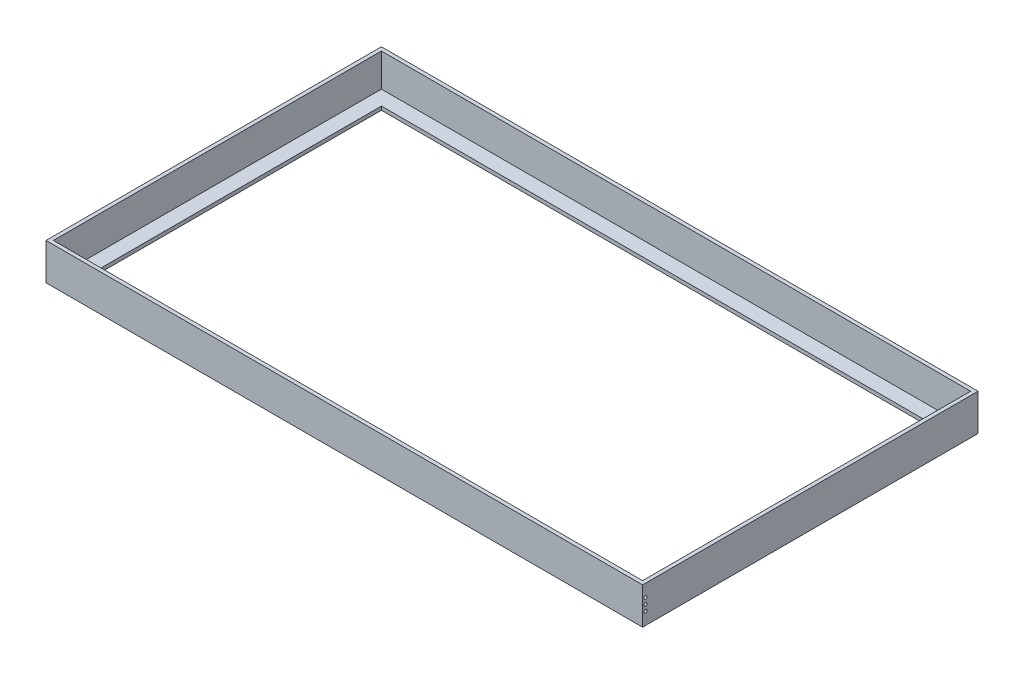
ISO-10303-21;
HEADER;
FILE_DESCRIPTION(('STEP AP214'),'2;1');
FILE_NAME('part.step','',(''),(''),'','','');
FILE_SCHEMA(('AUTOMOTIVE_DESIGN { 1 0 10303 214 1 1 1 1 }'));
ENDSEC;
DATA;
#1=APPLICATION_CONTEXT('core data for automotive mechanical design processes');
#2=APPLICATION_PROTOCOL_DEFINITION('international standard','automotive_design',2000,#1);
#3=PRODUCT_CONTEXT('',#1,'mechanical');
#4=PRODUCT('Part','Part','',(#3));
#5=PRODUCT_RELATED_PRODUCT_CATEGORY('part','',(#4));
#6=PRODUCT_DEFINITION_FORMATION('','',#4);
#7=PRODUCT_DEFINITION_CONTEXT('part definition',#1,'design');
#8=PRODUCT_DEFINITION('design','',#6,#7);
#9=PRODUCT_DEFINITION_SHAPE('','',#8);
#10=(LENGTH_UNIT() NAMED_UNIT(*) SI_UNIT(.MILLI.,.METRE.));
#11=(NAMED_UNIT(*) PLANE_ANGLE_UNIT() SI_UNIT($,.RADIAN.));
#12=(NAMED_UNIT(*) SI_UNIT($,.STERADIAN.) SOLID_ANGLE_UNIT());
#13=UNCERTAINTY_MEASURE_WITH_UNIT(LENGTH_MEASURE(1.E-05),#10,'distance_accuracy_value','');
#14=(GEOMETRIC_REPRESENTATION_CONTEXT(3) GLOBAL_UNCERTAINTY_ASSIGNED_CONTEXT((#13)) GLOBAL_UNIT_ASSIGNED_CONTEXT((#10,
#11,#12)) REPRESENTATION_CONTEXT('',''));
#15=CARTESIAN_POINT('',(0.,0.,0.));
#16=DIRECTION('',(0.,0.,1.));
#17=DIRECTION('',(1.,0.,0.));
#18=AXIS2_PLACEMENT_3D('',#15,#16,#17);
#19=CARTESIAN_POINT('',(0.,100.,-10.));
#20=DIRECTION('',(0.,0.,-1.));
#21=DIRECTION('',(-1.,0.,0.));
#22=AXIS2_PLACEMENT_3D('',#19,#20,#21);
#23=PLANE('',#22);
#24=DIRECTION('',(1.,0.,0.));
#25=VECTOR('',#24,1.);
#26=CARTESIAN_POINT('',(0.,37.0930549951046,-10.));
#27=LINE('',#26,#25);
#28=CARTESIAN_POINT('',(10.,37.0930549951046,-10.));
#29=VERTEX_POINT('',#28);
#30=CARTESIAN_POINT('',(1616.4,37.0930549951046,-10.));
#31=VERTEX_POINT('',#30);
#32=EDGE_CURVE('E66',#29,#31,#27,.T.);
#33=ORIENTED_EDGE('',*,*,#32,.F.);
#34=DIRECTION('',(0.,-1.,0.));
#35=VECTOR('',#34,1.);
#36=CARTESIAN_POINT('',(10.,100.,-10.));
#37=LINE('',#36,#35);
#38=CARTESIAN_POINT('',(10.,46.6269450048954,-10.));
#39=VERTEX_POINT('',#38);
#40=EDGE_CURVE('E214',#39,#29,#37,.T.);
#41=ORIENTED_EDGE('',*,*,#40,.F.);
#42=DIRECTION('',(1.,0.,0.));
#43=VECTOR('',#42,1.);
#44=CARTESIAN_POINT('',(0.,46.6269450048954,-10.));
#45=LINE('',#44,#43);
#46=CARTESIAN_POINT('',(1616.4,46.6269450048954,-10.));
#47=VERTEX_POINT('',#46);
#48=EDGE_CURVE('E288',#47,#39,#45,.F.);
#49=ORIENTED_EDGE('',*,*,#48,.F.);
#50=DIRECTION('',(0.,-1.,0.));
#51=VECTOR('',#50,1.);
#52=CARTESIAN_POINT('',(1616.4,100.,-10.));
#53=LINE('',#52,#51);
#54=EDGE_CURVE('E197',#47,#31,#53,.T.);
#55=ORIENTED_EDGE('',*,*,#54,.T.);
#56=EDGE_LOOP('',(#33,#41,#49,#55));
#57=FACE_BOUND('',#56,.T.);
#58=ADVANCED_FACE('F51',(#57),#23,.T.);
#59=DIRECTION('',(1.,0.,0.));
#60=VECTOR('',#59,1.);
#61=CARTESIAN_POINT('',(0.,69.6530549951046,-10.));
#62=LINE('',#61,#60);
#63=CARTESIAN_POINT('',(10.,69.6530549951046,-10.));
#64=VERTEX_POINT('',#63);
#65=CARTESIAN_POINT('',(1616.4,69.6530549951046,-10.));
#66=VERTEX_POINT('',#65);
#67=EDGE_CURVE('E74',#64,#66,#62,.T.);
#68=ORIENTED_EDGE('',*,*,#67,.F.);
#69=CARTESIAN_POINT('',(10.,100.,-10.));
#70=VERTEX_POINT('',#69);
#71=EDGE_CURVE('E217',#70,#64,#37,.T.);
#72=ORIENTED_EDGE('',*,*,#71,.F.);
#73=DIRECTION('',(1.,0.,0.));
#74=VECTOR('',#73,1.);
#75=CARTESIAN_POINT('',(0.,100.,-10.));
#76=LINE('',#75,#74);
#77=CARTESIAN_POINT('',(1616.4,100.,-10.));
#78=VERTEX_POINT('',#77);
#79=EDGE_CURVE('E370',#70,#78,#76,.T.);
#80=ORIENTED_EDGE('',*,*,#79,.T.);
#81=EDGE_CURVE('E201',#78,#66,#53,.T.);
#82=ORIENTED_EDGE('',*,*,#81,.T.);
#83=EDGE_LOOP('',(#68,#72,#80,#82));
#84=FACE_BOUND('',#83,.T.);
#85=ADVANCED_FACE('F413',(#84),#23,.T.);
#86=DIRECTION('',(1.,0.,0.));
#87=VECTOR('',#86,1.);
#88=CARTESIAN_POINT('',(0.,62.9069450048954,-10.));
#89=LINE('',#88,#87);
#90=CARTESIAN_POINT('',(1616.4,62.9069450048954,-10.));
#91=VERTEX_POINT('',#90);
#92=CARTESIAN_POINT('',(10.,62.9069450048954,-10.));
#93=VERTEX_POINT('',#92);
#94=EDGE_CURVE('E272',#91,#93,#89,.F.);
#95=ORIENTED_EDGE('',*,*,#94,.F.);
#96=CARTESIAN_POINT('',(1616.4,53.3730549951046,-10.));
#97=VERTEX_POINT('',#96);
#98=EDGE_CURVE('E200',#91,#97,#53,.T.);
#99=ORIENTED_EDGE('',*,*,#98,.T.);
#100=DIRECTION('',(1.,0.,0.));
#101=VECTOR('',#100,1.);
#102=CARTESIAN_POINT('',(0.,53.3730549951046,-10.));
#103=LINE('',#102,#101);
#104=CARTESIAN_POINT('',(10.,53.3730549951046,-10.));
#105=VERTEX_POINT('',#104);
#106=EDGE_CURVE('E290',#105,#97,#103,.T.);
#107=ORIENTED_EDGE('',*,*,#106,.F.);
#108=EDGE_CURVE('E216',#93,#105,#37,.T.);
#109=ORIENTED_EDGE('',*,*,#108,.F.);
#110=EDGE_LOOP('',(#95,#99,#107,#109));
#111=FACE_BOUND('',#110,.T.);
#112=ADVANCED_FACE('F276',(#111),#23,.T.);
#113=CARTESIAN_POINT('',(0.,10.,0.));
#114=DIRECTION('',(0.,-1.,0.));
#115=DIRECTION('',(0.,0.,-1.));
#116=AXIS2_PLACEMENT_3D('',#113,#114,#115);
#117=PLANE('',#116);
#118=DIRECTION('',(0.,0.,1.));
#119=VECTOR('',#118,1.);
#120=CARTESIAN_POINT('',(10.,10.,0.));
#121=LINE('',#120,#119);
#122=CARTESIAN_POINT('',(10.,10.,-904.4));
#123=VERTEX_POINT('',#122);
#124=CARTESIAN_POINT('',(10.,10.,-10.));
#125=VERTEX_POINT('',#124);
#126=EDGE_CURVE('E342',#123,#125,#121,.T.);
#127=ORIENTED_EDGE('',*,*,#126,.T.);
#128=DIRECTION('',(1.,0.,0.));
#129=VECTOR('',#128,1.);
#130=CARTESIAN_POINT('',(0.,10.,-10.));
#131=LINE('',#130,#129);
#132=CARTESIAN_POINT('',(1616.4,10.,-10.));
#133=VERTEX_POINT('',#132);
#134=EDGE_CURVE('E353',#125,#133,#131,.T.);
#135=ORIENTED_EDGE('',*,*,#134,.T.);
#136=DIRECTION('',(0.,0.,-1.));
#137=VECTOR('',#136,1.);
#138=CARTESIAN_POINT('',(1616.4,10.,0.));
#139=LINE('',#138,#137);
#140=CARTESIAN_POINT('',(1616.4,10.,-904.4));
#141=VERTEX_POINT('',#140);
#142=EDGE_CURVE('E195',#133,#141,#139,.T.);
#143=ORIENTED_EDGE('',*,*,#142,.T.);
#144=DIRECTION('',(-1.,0.,0.));
#145=VECTOR('',#144,1.);
#146=CARTESIAN_POINT('',(0.,10.,-904.4));
#147=LINE('',#146,#145);
#148=EDGE_CURVE('E357',#141,#123,#147,.T.);
#149=ORIENTED_EDGE('',*,*,#148,.T.);
#150=EDGE_LOOP('',(#127,#135,#143,#149));
#151=FACE_BOUND('',#150,.T.);
#152=DIRECTION('',(0.,0.,1.));
#153=VECTOR('',#152,1.);
#154=CARTESIAN_POINT('',(50.,10.,-864.4));
#155=LINE('',#154,#153);
#156=CARTESIAN_POINT('',(50.,10.,-864.4));
#157=VERTEX_POINT('',#156);
#158=CARTESIAN_POINT('',(50.0000000000001,10.,-50.));
#159=VERTEX_POINT('',#158);
#160=EDGE_CURVE('E307',#157,#159,#155,.T.);
#161=ORIENTED_EDGE('',*,*,#160,.F.);
#162=DIRECTION('',(-1.,0.,0.));
#163=VECTOR('',#162,1.);
#164=CARTESIAN_POINT('',(50.,10.,-864.4));
#165=LINE('',#164,#163);
#166=CARTESIAN_POINT('',(1576.4,10.,-864.4));
#167=VERTEX_POINT('',#166);
#168=EDGE_CURVE('E313',#167,#157,#165,.T.);
#169=ORIENTED_EDGE('',*,*,#168,.F.);
#170=DIRECTION('',(0.,0.,-1.));
#171=VECTOR('',#170,1.);
#172=CARTESIAN_POINT('',(1576.4,10.,-864.4));
#173=LINE('',#172,#171);
#174=CARTESIAN_POINT('',(1576.4,10.,-50.));
#175=VERTEX_POINT('',#174);
#176=EDGE_CURVE('E333',#175,#167,#173,.T.);
#177=ORIENTED_EDGE('',*,*,#176,.F.);
#178=DIRECTION('',(1.,0.,0.));
#179=VECTOR('',#178,1.);
#180=CARTESIAN_POINT('',(50.0000000000001,10.,-50.));
#181=LINE('',#180,#179);
#182=EDGE_CURVE('E329',#159,#175,#181,.T.);
#183=ORIENTED_EDGE('',*,*,#182,.F.);
#184=EDGE_LOOP('',(#161,#169,#177,#183));
#185=FACE_BOUND('',#184,.T.);
#186=ADVANCED_FACE('F425',(#151,#185),#117,.F.);
#187=CARTESIAN_POINT('',(0.,100.,0.));
#188=DIRECTION('',(0.,-1.,0.));
#189=DIRECTION('',(0.,0.,-1.));
#190=AXIS2_PLACEMENT_3D('',#187,#188,#189);
#191=PLANE('',#190);
#192=DIRECTION('',(0.,0.,1.));
#193=VECTOR('',#192,1.);
#194=CARTESIAN_POINT('',(0.,100.,0.));
#195=LINE('',#194,#193);
#196=CARTESIAN_POINT('',(0.,100.,-914.4));
#197=VERTEX_POINT('',#196);
#198=CARTESIAN_POINT('',(0.,100.,0.));
#199=VERTEX_POINT('',#198);
#200=EDGE_CURVE('E250',#197,#199,#195,.T.);
#201=ORIENTED_EDGE('',*,*,#200,.T.);
#202=DIRECTION('',(1.,0.,0.));
#203=VECTOR('',#202,1.);
#204=CARTESIAN_POINT('',(0.,100.,0.));
#205=LINE('',#204,#203);
#206=CARTESIAN_POINT('',(1626.4,100.,0.));
#207=VERTEX_POINT('',#206);
#208=EDGE_CURVE('E377',#199,#207,#205,.T.);
#209=ORIENTED_EDGE('',*,*,#208,.T.);
#210=DIRECTION('',(0.,0.,-1.));
#211=VECTOR('',#210,1.);
#212=CARTESIAN_POINT('',(1626.4,100.,0.));
#213=LINE('',#212,#211);
#214=CARTESIAN_POINT('',(1626.4,100.,-914.4));
#215=VERTEX_POINT('',#214);
#216=EDGE_CURVE('E379',#207,#215,#213,.T.);
#217=ORIENTED_EDGE('',*,*,#216,.T.);
#218=DIRECTION('',(-1.,0.,0.));
#219=VECTOR('',#218,1.);
#220=CARTESIAN_POINT('',(0.,100.,-914.4));
#221=LINE('',#220,#219);
#222=EDGE_CURVE('E242',#215,#197,#221,.T.);
#223=ORIENTED_EDGE('',*,*,#222,.T.);
#224=EDGE_LOOP('',(#201,#209,#217,#223));
#225=FACE_BOUND('',#224,.T.);
#226=DIRECTION('',(0.,0.,1.));
#227=VECTOR('',#226,1.);
#228=CARTESIAN_POINT('',(10.,100.,0.));
#229=LINE('',#228,#227);
#230=CARTESIAN_POINT('',(10.,100.,-904.4));
#231=VERTEX_POINT('',#230);
#232=EDGE_CURVE('E444',#231,#70,#229,.T.);
#233=ORIENTED_EDGE('',*,*,#232,.F.);
#234=DIRECTION('',(-1.,0.,0.));
#235=VECTOR('',#234,1.);
#236=CARTESIAN_POINT('',(0.,100.,-904.4));
#237=LINE('',#236,#235);
#238=CARTESIAN_POINT('',(1616.4,100.,-904.4));
#239=VERTEX_POINT('',#238);
#240=EDGE_CURVE('E360',#239,#231,#237,.T.);
#241=ORIENTED_EDGE('',*,*,#240,.F.);
#242=DIRECTION('',(0.,0.,-1.));
#243=VECTOR('',#242,1.);
#244=CARTESIAN_POINT('',(1616.4,100.,0.));
#245=LINE('',#244,#243);
#246=EDGE_CURVE('E365',#78,#239,#245,.T.);
#247=ORIENTED_EDGE('',*,*,#246,.F.);
#248=ORIENTED_EDGE('',*,*,#79,.F.);
#249=EDGE_LOOP('',(#233,#241,#247,#248));
#250=FACE_BOUND('',#249,.T.);
#251=ADVANCED_FACE('F387',(#225,#250),#191,.F.);
#252=CARTESIAN_POINT('',(0.,100.,0.));
#253=DIRECTION('',(1.,0.,0.));
#254=DIRECTION('',(0.,0.,-1.));
#255=AXIS2_PLACEMENT_3D('',#252,#253,#254);
#256=PLANE('',#255);
#257=CARTESIAN_POINT('',(0.,33.72,-7.85));
#258=DIRECTION('',(1.,0.,0.));
#259=DIRECTION('',(0.,0.,-1.));
#260=AXIS2_PLACEMENT_3D('',#257,#258,#259);
#261=CIRCLE('',#260,4.);
#262=CARTESIAN_POINT('',(0.,33.72,-11.85));
#263=VERTEX_POINT('',#262);
#264=EDGE_CURVE('E190',#263,#263,#261,.T.);
#265=ORIENTED_EDGE('',*,*,#264,.T.);
#266=EDGE_LOOP('',(#265));
#267=FACE_BOUND('',#266,.T.);
#268=CARTESIAN_POINT('',(0.,66.28,-7.85));
#269=DIRECTION('',(1.,0.,0.));
#270=DIRECTION('',(0.,0.,-1.));
#271=AXIS2_PLACEMENT_3D('',#268,#269,#270);
#272=CIRCLE('',#271,4.);
#273=CARTESIAN_POINT('',(0.,66.28,-11.85));
#274=VERTEX_POINT('',#273);
#275=EDGE_CURVE('E280',#274,#274,#272,.T.);
#276=ORIENTED_EDGE('',*,*,#275,.T.);
#277=EDGE_LOOP('',(#276));
#278=FACE_BOUND('',#277,.T.);
#279=CARTESIAN_POINT('',(0.,50.,-7.85));
#280=DIRECTION('',(1.,0.,0.));
#281=DIRECTION('',(0.,0.,-1.));
#282=AXIS2_PLACEMENT_3D('',#279,#280,#281);
#283=CIRCLE('',#282,4.00000000000001);
#284=CARTESIAN_POINT('',(0.,50.,-11.85));
#285=VERTEX_POINT('',#284);
#286=EDGE_CURVE('E294',#285,#285,#283,.T.);
#287=ORIENTED_EDGE('',*,*,#286,.T.);
#288=EDGE_LOOP('',(#287));
#289=FACE_BOUND('',#288,.T.);
#290=DIRECTION('',(0.,0.,1.));
#291=VECTOR('',#290,1.);
#292=CARTESIAN_POINT('',(0.,0.,0.));
#293=LINE('',#292,#291);
#294=CARTESIAN_POINT('',(0.,0.,-914.4));
#295=VERTEX_POINT('',#294);
#296=CARTESIAN_POINT('',(0.,0.,0.));
#297=VERTEX_POINT('',#296);
#298=EDGE_CURVE('E227',#295,#297,#293,.T.);
#299=ORIENTED_EDGE('',*,*,#298,.T.);
#300=DIRECTION('',(0.,-1.,0.));
#301=VECTOR('',#300,1.);
#302=CARTESIAN_POINT('',(0.,100.,0.));
#303=LINE('',#302,#301);
#304=EDGE_CURVE('E262',#199,#297,#303,.T.);
#305=ORIENTED_EDGE('',*,*,#304,.F.);
#306=ORIENTED_EDGE('',*,*,#200,.F.);
#307=DIRECTION('',(0.,-1.,0.));
#308=VECTOR('',#307,1.);
#309=CARTESIAN_POINT('',(0.,100.,-914.4));
#310=LINE('',#309,#308);
#311=EDGE_CURVE('E251',#197,#295,#310,.T.);
#312=ORIENTED_EDGE('',*,*,#311,.T.);
#313=EDGE_LOOP('',(#299,#305,#306,#312));
#314=FACE_BOUND('',#313,.T.);
#315=ADVANCED_FACE('F53',(#267,#278,#289,#314),#256,.F.);
#316=CARTESIAN_POINT('',(0.,100.,0.));
#317=DIRECTION('',(0.,0.,-1.));
#318=DIRECTION('',(-1.,0.,0.));
#319=AXIS2_PLACEMENT_3D('',#316,#317,#318);
#320=PLANE('',#319);
#321=DIRECTION('',(1.,0.,0.));
#322=VECTOR('',#321,1.);
#323=CARTESIAN_POINT('',(0.,0.,0.));
#324=LINE('',#323,#322);
#325=CARTESIAN_POINT('',(1626.4,0.,0.));
#326=VERTEX_POINT('',#325);
#327=EDGE_CURVE('E232',#297,#326,#324,.T.);
#328=ORIENTED_EDGE('',*,*,#327,.T.);
#329=DIRECTION('',(0.,-1.,0.));
#330=VECTOR('',#329,1.);
#331=CARTESIAN_POINT('',(1626.4,100.,0.));
#332=LINE('',#331,#330);
#333=EDGE_CURVE('E258',#207,#326,#332,.T.);
#334=ORIENTED_EDGE('',*,*,#333,.F.);
#335=ORIENTED_EDGE('',*,*,#208,.F.);
#336=ORIENTED_EDGE('',*,*,#304,.T.);
#337=EDGE_LOOP('',(#328,#334,#335,#336));
#338=FACE_BOUND('',#337,.T.);
#339=ADVANCED_FACE('F394',(#338),#320,.F.);
#340=CARTESIAN_POINT('',(1626.4,100.,0.));
#341=DIRECTION('',(-1.,0.,0.));
#342=DIRECTION('',(0.,0.,1.));
#343=AXIS2_PLACEMENT_3D('',#340,#341,#342);
#344=PLANE('',#343);
#345=CARTESIAN_POINT('',(1626.4,33.72,-7.85));
#346=DIRECTION('',(1.,0.,0.));
#347=DIRECTION('',(0.,0.,-1.));
#348=AXIS2_PLACEMENT_3D('',#345,#346,#347);
#349=CIRCLE('',#348,4.);
#350=CARTESIAN_POINT('',(1626.4,33.72,-11.85));
#351=VERTEX_POINT('',#350);
#352=EDGE_CURVE('E483',#351,#351,#349,.T.);
#353=ORIENTED_EDGE('',*,*,#352,.F.);
#354=EDGE_LOOP('',(#353));
#355=FACE_BOUND('',#354,.T.);
#356=CARTESIAN_POINT('',(1626.4,66.28,-7.85));
#357=DIRECTION('',(1.,0.,0.));
#358=DIRECTION('',(0.,0.,-1.));
#359=AXIS2_PLACEMENT_3D('',#356,#357,#358);
#360=CIRCLE('',#359,4.);
#361=CARTESIAN_POINT('',(1626.4,66.28,-11.85));
#362=VERTEX_POINT('',#361);
#363=EDGE_CURVE('E454',#362,#362,#360,.T.);
#364=ORIENTED_EDGE('',*,*,#363,.F.);
#365=EDGE_LOOP('',(#364));
#366=FACE_BOUND('',#365,.T.);
#367=CARTESIAN_POINT('',(1626.4,50.,-7.85));
#368=DIRECTION('',(1.,0.,0.));
#369=DIRECTION('',(0.,0.,-1.));
#370=AXIS2_PLACEMENT_3D('',#367,#368,#369);
#371=CIRCLE('',#370,4.00000000000001);
#372=CARTESIAN_POINT('',(1626.4,50.,-11.85));
#373=VERTEX_POINT('',#372);
#374=EDGE_CURVE('E301',#373,#373,#371,.T.);
#375=ORIENTED_EDGE('',*,*,#374,.F.);
#376=EDGE_LOOP('',(#375));
#377=FACE_BOUND('',#376,.T.);
#378=DIRECTION('',(0.,0.,-1.));
#379=VECTOR('',#378,1.);
#380=CARTESIAN_POINT('',(1626.4,0.,0.));
#381=LINE('',#380,#379);
#382=CARTESIAN_POINT('',(1626.4,0.,-914.4));
#383=VERTEX_POINT('',#382);
#384=EDGE_CURVE('E239',#326,#383,#381,.T.);
#385=ORIENTED_EDGE('',*,*,#384,.T.);
#386=DIRECTION('',(0.,-1.,0.));
#387=VECTOR('',#386,1.);
#388=CARTESIAN_POINT('',(1626.4,100.,-914.4));
#389=LINE('',#388,#387);
#390=EDGE_CURVE('E254',#215,#383,#389,.T.);
#391=ORIENTED_EDGE('',*,*,#390,.F.);
#392=ORIENTED_EDGE('',*,*,#216,.F.);
#393=ORIENTED_EDGE('',*,*,#333,.T.);
#394=EDGE_LOOP('',(#385,#391,#392,#393));
#395=FACE_BOUND('',#394,.T.);
#396=ADVANCED_FACE('F398',(#355,#366,#377,#395),#344,.F.);
#397=CARTESIAN_POINT('',(0.,100.,-914.4));
#398=DIRECTION('',(0.,0.,1.));
#399=DIRECTION('',(1.,0.,0.));
#400=AXIS2_PLACEMENT_3D('',#397,#398,#399);
#401=PLANE('',#400);
#402=DIRECTION('',(-1.,0.,0.));
#403=VECTOR('',#402,1.);
#404=CARTESIAN_POINT('',(0.,0.,-914.4));
#405=LINE('',#404,#403);
#406=EDGE_CURVE('E247',#383,#295,#405,.T.);
#407=ORIENTED_EDGE('',*,*,#406,.T.);
#408=ORIENTED_EDGE('',*,*,#311,.F.);
#409=ORIENTED_EDGE('',*,*,#222,.F.);
#410=ORIENTED_EDGE('',*,*,#390,.T.);
#411=EDGE_LOOP('',(#407,#408,#409,#410));
#412=FACE_BOUND('',#411,.T.);
#413=ADVANCED_FACE('F391',(#412),#401,.F.);
#414=CARTESIAN_POINT('',(0.,0.,0.));
#415=DIRECTION('',(0.,-1.,0.));
#416=DIRECTION('',(0.,0.,-1.));
#417=AXIS2_PLACEMENT_3D('',#414,#415,#416);
#418=PLANE('',#417);
#419=DIRECTION('',(0.,0.,1.));
#420=VECTOR('',#419,1.);
#421=CARTESIAN_POINT('',(50.,0.,-864.4));
#422=LINE('',#421,#420);
#423=CARTESIAN_POINT('',(50.,0.,-864.4));
#424=VERTEX_POINT('',#423);
#425=CARTESIAN_POINT('',(50.0000000000001,0.,-50.));
#426=VERTEX_POINT('',#425);
#427=EDGE_CURVE('E308',#424,#426,#422,.T.);
#428=ORIENTED_EDGE('',*,*,#427,.T.);
#429=DIRECTION('',(1.,0.,0.));
#430=VECTOR('',#429,1.);
#431=CARTESIAN_POINT('',(50.0000000000001,0.,-50.));
#432=LINE('',#431,#430);
#433=CARTESIAN_POINT('',(1576.4,0.,-50.));
#434=VERTEX_POINT('',#433);
#435=EDGE_CURVE('E312',#426,#434,#432,.T.);
#436=ORIENTED_EDGE('',*,*,#435,.T.);
#437=DIRECTION('',(0.,0.,-1.));
#438=VECTOR('',#437,1.);
#439=CARTESIAN_POINT('',(1576.4,0.,-864.4));
#440=LINE('',#439,#438);
#441=CARTESIAN_POINT('',(1576.4,0.,-864.4));
#442=VERTEX_POINT('',#441);
#443=EDGE_CURVE('E317',#434,#442,#440,.T.);
#444=ORIENTED_EDGE('',*,*,#443,.T.);
#445=DIRECTION('',(-1.,0.,0.));
#446=VECTOR('',#445,1.);
#447=CARTESIAN_POINT('',(50.,0.,-864.4));
#448=LINE('',#447,#446);
#449=EDGE_CURVE('E321',#442,#424,#448,.T.);
#450=ORIENTED_EDGE('',*,*,#449,.T.);
#451=EDGE_LOOP('',(#428,#436,#444,#450));
#452=FACE_BOUND('',#451,.T.);
#453=ORIENTED_EDGE('',*,*,#298,.F.);
#454=ORIENTED_EDGE('',*,*,#406,.F.);
#455=ORIENTED_EDGE('',*,*,#384,.F.);
#456=ORIENTED_EDGE('',*,*,#327,.F.);
#457=EDGE_LOOP('',(#453,#454,#455,#456));
#458=FACE_BOUND('',#457,.T.);
#459=ADVANCED_FACE('F400',(#452,#458),#418,.T.);
#460=CARTESIAN_POINT('',(10.,100.,0.));
#461=DIRECTION('',(1.,0.,0.));
#462=DIRECTION('',(0.,0.,-1.));
#463=AXIS2_PLACEMENT_3D('',#460,#461,#462);
#464=PLANE('',#463);
#465=CARTESIAN_POINT('',(10.,33.72,-7.85));
#466=DIRECTION('',(1.,0.,0.));
#467=DIRECTION('',(0.,0.,-1.));
#468=AXIS2_PLACEMENT_3D('',#465,#466,#467);
#469=CIRCLE('',#468,4.);
#470=CARTESIAN_POINT('',(10.,30.3469450048954,-10.));
#471=VERTEX_POINT('',#470);
#472=EDGE_CURVE('E452',#471,#29,#469,.T.);
#473=ORIENTED_EDGE('',*,*,#472,.F.);
#474=EDGE_CURVE('E188',#471,#125,#37,.T.);
#475=ORIENTED_EDGE('',*,*,#474,.T.);
#476=ORIENTED_EDGE('',*,*,#126,.F.);
#477=DIRECTION('',(0.,-1.,0.));
#478=VECTOR('',#477,1.);
#479=CARTESIAN_POINT('',(10.,100.,-904.4));
#480=LINE('',#479,#478);
#481=EDGE_CURVE('E204',#231,#123,#480,.T.);
#482=ORIENTED_EDGE('',*,*,#481,.F.);
#483=ORIENTED_EDGE('',*,*,#232,.T.);
#484=ORIENTED_EDGE('',*,*,#71,.T.);
#485=CARTESIAN_POINT('',(10.,66.28,-7.85));
#486=DIRECTION('',(1.,0.,0.));
#487=DIRECTION('',(0.,0.,-1.));
#488=AXIS2_PLACEMENT_3D('',#485,#486,#487);
#489=CIRCLE('',#488,4.);
#490=EDGE_CURVE('E467',#93,#64,#489,.T.);
#491=ORIENTED_EDGE('',*,*,#490,.F.);
#492=ORIENTED_EDGE('',*,*,#108,.T.);
#493=CARTESIAN_POINT('',(10.,50.,-7.85));
#494=DIRECTION('',(1.,0.,0.));
#495=DIRECTION('',(0.,0.,-1.));
#496=AXIS2_PLACEMENT_3D('',#493,#494,#495);
#497=CIRCLE('',#496,4.00000000000001);
#498=EDGE_CURVE('E298',#39,#105,#497,.T.);
#499=ORIENTED_EDGE('',*,*,#498,.F.);
#500=ORIENTED_EDGE('',*,*,#40,.T.);
#501=EDGE_LOOP('',(#473,#475,#476,#482,#483,#484,#491,#492,#499,#500));
#502=FACE_BOUND('',#501,.T.);
#503=ADVANCED_FACE('F402',(#502),#464,.T.);
#504=DIRECTION('',(1.,0.,0.));
#505=VECTOR('',#504,1.);
#506=CARTESIAN_POINT('',(0.,30.3469450048954,-10.));
#507=LINE('',#506,#505);
#508=CARTESIAN_POINT('',(1616.4,30.3469450048954,-10.));
#509=VERTEX_POINT('',#508);
#510=EDGE_CURVE('E176',#509,#471,#507,.F.);
#511=ORIENTED_EDGE('',*,*,#510,.F.);
#512=EDGE_CURVE('E186',#509,#133,#53,.T.);
#513=ORIENTED_EDGE('',*,*,#512,.T.);
#514=ORIENTED_EDGE('',*,*,#134,.F.);
#515=ORIENTED_EDGE('',*,*,#474,.F.);
#516=EDGE_LOOP('',(#511,#513,#514,#515));
#517=FACE_BOUND('',#516,.T.);
#518=ADVANCED_FACE('F184',(#517),#23,.T.);
#519=CARTESIAN_POINT('',(1616.4,100.,0.));
#520=DIRECTION('',(-1.,0.,0.));
#521=DIRECTION('',(0.,0.,1.));
#522=AXIS2_PLACEMENT_3D('',#519,#520,#521);
#523=PLANE('',#522);
#524=CARTESIAN_POINT('',(1616.4,33.72,-7.85));
#525=DIRECTION('',(-1.,0.,0.));
#526=DIRECTION('',(0.,0.,1.));
#527=AXIS2_PLACEMENT_3D('',#524,#525,#526);
#528=CIRCLE('',#527,4.);
#529=EDGE_CURVE('E13',#31,#509,#528,.T.);
#530=ORIENTED_EDGE('',*,*,#529,.F.);
#531=ORIENTED_EDGE('',*,*,#54,.F.);
#532=CARTESIAN_POINT('',(1616.4,50.,-7.85));
#533=DIRECTION('',(-1.,0.,0.));
#534=DIRECTION('',(0.,0.,1.));
#535=AXIS2_PLACEMENT_3D('',#532,#533,#534);
#536=CIRCLE('',#535,4.00000000000001);
#537=EDGE_CURVE('E266',#97,#47,#536,.T.);
#538=ORIENTED_EDGE('',*,*,#537,.F.);
#539=ORIENTED_EDGE('',*,*,#98,.F.);
#540=CARTESIAN_POINT('',(1616.4,66.28,-7.85));
#541=DIRECTION('',(-1.,0.,0.));
#542=DIRECTION('',(0.,0.,1.));
#543=AXIS2_PLACEMENT_3D('',#540,#541,#542);
#544=CIRCLE('',#543,4.);
#545=EDGE_CURVE('E60',#66,#91,#544,.T.);
#546=ORIENTED_EDGE('',*,*,#545,.F.);
#547=ORIENTED_EDGE('',*,*,#81,.F.);
#548=ORIENTED_EDGE('',*,*,#246,.T.);
#549=DIRECTION('',(0.,-1.,0.));
#550=VECTOR('',#549,1.);
#551=CARTESIAN_POINT('',(1616.4,100.,-904.4));
#552=LINE('',#551,#550);
#553=EDGE_CURVE('E198',#239,#141,#552,.T.);
#554=ORIENTED_EDGE('',*,*,#553,.T.);
#555=ORIENTED_EDGE('',*,*,#142,.F.);
#556=ORIENTED_EDGE('',*,*,#512,.F.);
#557=EDGE_LOOP('',(#530,#531,#538,#539,#546,#547,#548,#554,#555,#556));
#558=FACE_BOUND('',#557,.T.);
#559=ADVANCED_FACE('F193',(#558),#523,.T.);
#560=CARTESIAN_POINT('',(0.,100.,-904.4));
#561=DIRECTION('',(0.,0.,1.));
#562=DIRECTION('',(1.,0.,0.));
#563=AXIS2_PLACEMENT_3D('',#560,#561,#562);
#564=PLANE('',#563);
#565=ORIENTED_EDGE('',*,*,#148,.F.);
#566=ORIENTED_EDGE('',*,*,#553,.F.);
#567=ORIENTED_EDGE('',*,*,#240,.T.);
#568=ORIENTED_EDGE('',*,*,#481,.T.);
#569=EDGE_LOOP('',(#565,#566,#567,#568));
#570=FACE_BOUND('',#569,.T.);
#571=ADVANCED_FACE('F423',(#570),#564,.T.);
#572=CARTESIAN_POINT('',(50.,0.,-864.4));
#573=DIRECTION('',(-1.,0.,0.));
#574=DIRECTION('',(0.,0.,1.));
#575=AXIS2_PLACEMENT_3D('',#572,#573,#574);
#576=PLANE('',#575);
#577=ORIENTED_EDGE('',*,*,#160,.T.);
#578=DIRECTION('',(0.,1.,0.));
#579=VECTOR('',#578,1.);
#580=CARTESIAN_POINT('',(50.0000000000001,0.,-50.));
#581=LINE('',#580,#579);
#582=EDGE_CURVE('E325',#426,#159,#581,.T.);
#583=ORIENTED_EDGE('',*,*,#582,.F.);
#584=ORIENTED_EDGE('',*,*,#427,.F.);
#585=DIRECTION('',(0.,1.,0.));
#586=VECTOR('',#585,1.);
#587=CARTESIAN_POINT('',(50.,0.,-864.4));
#588=LINE('',#587,#586);
#589=EDGE_CURVE('E339',#424,#157,#588,.T.);
#590=ORIENTED_EDGE('',*,*,#589,.T.);
#591=EDGE_LOOP('',(#577,#583,#584,#590));
#592=FACE_BOUND('',#591,.T.);
#593=ADVANCED_FACE('F436',(#592),#576,.F.);
#594=CARTESIAN_POINT('',(50.,0.,-864.4));
#595=DIRECTION('',(0.,0.,-1.));
#596=DIRECTION('',(-1.,0.,0.));
#597=AXIS2_PLACEMENT_3D('',#594,#595,#596);
#598=PLANE('',#597);
#599=ORIENTED_EDGE('',*,*,#168,.T.);
#600=ORIENTED_EDGE('',*,*,#589,.F.);
#601=ORIENTED_EDGE('',*,*,#449,.F.);
#602=DIRECTION('',(0.,1.,0.));
#603=VECTOR('',#602,1.);
#604=CARTESIAN_POINT('',(1576.4,0.,-864.4));
#605=LINE('',#604,#603);
#606=EDGE_CURVE('E343',#442,#167,#605,.T.);
#607=ORIENTED_EDGE('',*,*,#606,.T.);
#608=EDGE_LOOP('',(#599,#600,#601,#607));
#609=FACE_BOUND('',#608,.T.);
#610=ADVANCED_FACE('F440',(#609),#598,.F.);
#611=CARTESIAN_POINT('',(1576.4,0.,-864.4));
#612=DIRECTION('',(1.,0.,0.));
#613=DIRECTION('',(0.,0.,-1.));
#614=AXIS2_PLACEMENT_3D('',#611,#612,#613);
#615=PLANE('',#614);
#616=ORIENTED_EDGE('',*,*,#176,.T.);
#617=ORIENTED_EDGE('',*,*,#606,.F.);
#618=ORIENTED_EDGE('',*,*,#443,.F.);
#619=DIRECTION('',(0.,1.,0.));
#620=VECTOR('',#619,1.);
#621=CARTESIAN_POINT('',(1576.4,0.,-50.));
#622=LINE('',#621,#620);
#623=EDGE_CURVE('E347',#434,#175,#622,.T.);
#624=ORIENTED_EDGE('',*,*,#623,.T.);
#625=EDGE_LOOP('',(#616,#617,#618,#624));
#626=FACE_BOUND('',#625,.T.);
#627=ADVANCED_FACE('F498',(#626),#615,.F.);
#628=CARTESIAN_POINT('',(50.0000000000001,0.,-50.));
#629=DIRECTION('',(0.,0.,1.));
#630=DIRECTION('',(1.,0.,0.));
#631=AXIS2_PLACEMENT_3D('',#628,#629,#630);
#632=PLANE('',#631);
#633=ORIENTED_EDGE('',*,*,#182,.T.);
#634=ORIENTED_EDGE('',*,*,#623,.F.);
#635=ORIENTED_EDGE('',*,*,#435,.F.);
#636=ORIENTED_EDGE('',*,*,#582,.T.);
#637=EDGE_LOOP('',(#633,#634,#635,#636));
#638=FACE_BOUND('',#637,.T.);
#639=ADVANCED_FACE('F493',(#638),#632,.F.);
#640=CARTESIAN_POINT('',(0.,50.,-7.85));
#641=DIRECTION('',(1.,0.,0.));
#642=DIRECTION('',(0.,0.,-1.));
#643=AXIS2_PLACEMENT_3D('',#640,#641,#642);
#644=CYLINDRICAL_SURFACE('',#643,4.00000000000001);
#645=ORIENTED_EDGE('',*,*,#498,.T.);
#646=ORIENTED_EDGE('',*,*,#106,.T.);
#647=ORIENTED_EDGE('',*,*,#537,.T.);
#648=ORIENTED_EDGE('',*,*,#48,.T.);
#649=EDGE_LOOP('',(#645,#646,#647,#648));
#650=FACE_BOUND('',#649,.T.);
#651=ORIENTED_EDGE('',*,*,#286,.F.);
#652=EDGE_LOOP('',(#651));
#653=FACE_BOUND('',#652,.T.);
#654=ORIENTED_EDGE('',*,*,#374,.T.);
#655=EDGE_LOOP('',(#654));
#656=FACE_BOUND('',#655,.T.);
#657=ADVANCED_FACE('F286',(#650,#653,#656),#644,.F.);
#658=CARTESIAN_POINT('',(0.,66.28,-7.85));
#659=DIRECTION('',(1.,0.,0.));
#660=DIRECTION('',(0.,0.,-1.));
#661=AXIS2_PLACEMENT_3D('',#658,#659,#660);
#662=CYLINDRICAL_SURFACE('',#661,4.);
#663=ORIENTED_EDGE('',*,*,#490,.T.);
#664=ORIENTED_EDGE('',*,*,#67,.T.);
#665=ORIENTED_EDGE('',*,*,#545,.T.);
#666=ORIENTED_EDGE('',*,*,#94,.T.);
#667=EDGE_LOOP('',(#663,#664,#665,#666));
#668=FACE_BOUND('',#667,.T.);
#669=ORIENTED_EDGE('',*,*,#275,.F.);
#670=EDGE_LOOP('',(#669));
#671=FACE_BOUND('',#670,.T.);
#672=ORIENTED_EDGE('',*,*,#363,.T.);
#673=EDGE_LOOP('',(#672));
#674=FACE_BOUND('',#673,.T.);
#675=ADVANCED_FACE('F270',(#668,#671,#674),#662,.F.);
#676=CARTESIAN_POINT('',(0.,33.72,-7.85));
#677=DIRECTION('',(1.,0.,0.));
#678=DIRECTION('',(0.,0.,-1.));
#679=AXIS2_PLACEMENT_3D('',#676,#677,#678);
#680=CYLINDRICAL_SURFACE('',#679,4.);
#681=ORIENTED_EDGE('',*,*,#472,.T.);
#682=ORIENTED_EDGE('',*,*,#32,.T.);
#683=ORIENTED_EDGE('',*,*,#529,.T.);
#684=ORIENTED_EDGE('',*,*,#510,.T.);
#685=EDGE_LOOP('',(#681,#682,#683,#684));
#686=FACE_BOUND('',#685,.T.);
#687=ORIENTED_EDGE('',*,*,#264,.F.);
#688=EDGE_LOOP('',(#687));
#689=FACE_BOUND('',#688,.T.);
#690=ORIENTED_EDGE('',*,*,#352,.T.);
#691=EDGE_LOOP('',(#690));
#692=FACE_BOUND('',#691,.T.);
#693=ADVANCED_FACE('F174',(#686,#689,#692),#680,.F.);
#694=CLOSED_SHELL('',(#58,#85,#112,#186,#251,#315,#339,#396,#413,#459,#503,#518,#559,#571,#593,
#610,#627,#639,#657,#675,#693));
#695=MANIFOLD_SOLID_BREP('B2',#694);
#696=ADVANCED_BREP_SHAPE_REPRESENTATION('',(#18,#695),#14);
#697=SHAPE_DEFINITION_REPRESENTATION(#9,#696);
ENDSEC;
END-ISO-10303-21;
